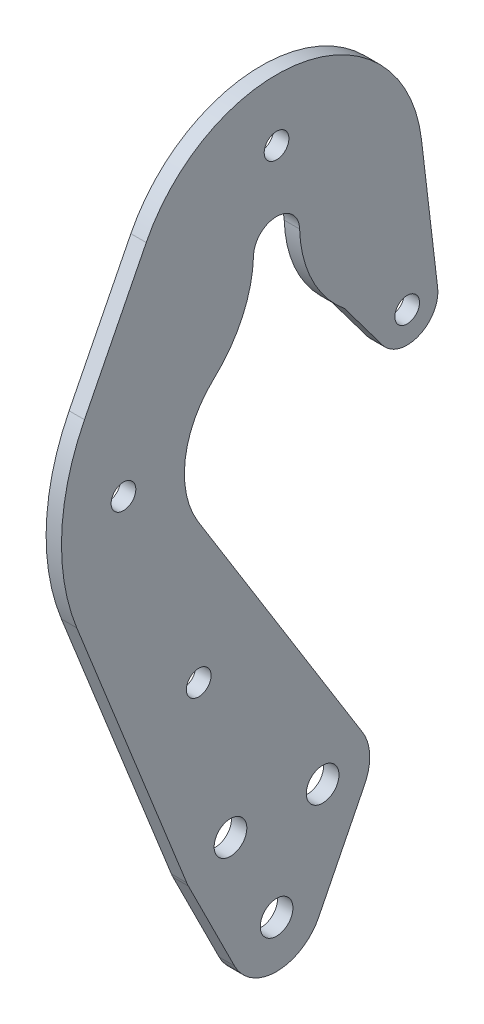
ISO-10303-21;
HEADER;
FILE_DESCRIPTION(('STEP AP214'),'2;1');
FILE_NAME('part.step','',(''),(''),'','','');
FILE_SCHEMA(('AUTOMOTIVE_DESIGN { 1 0 10303 214 1 1 1 1 }'));
ENDSEC;
DATA;
#1=APPLICATION_CONTEXT('core data for automotive mechanical design processes');
#2=APPLICATION_PROTOCOL_DEFINITION('international standard','automotive_design',2000,#1);
#3=PRODUCT_CONTEXT('',#1,'mechanical');
#4=PRODUCT('Part','Part','',(#3));
#5=PRODUCT_RELATED_PRODUCT_CATEGORY('part','',(#4));
#6=PRODUCT_DEFINITION_FORMATION('','',#4);
#7=PRODUCT_DEFINITION_CONTEXT('part definition',#1,'design');
#8=PRODUCT_DEFINITION('design','',#6,#7);
#9=PRODUCT_DEFINITION_SHAPE('','',#8);
#10=(LENGTH_UNIT() NAMED_UNIT(*) SI_UNIT(.MILLI.,.METRE.));
#11=(NAMED_UNIT(*) PLANE_ANGLE_UNIT() SI_UNIT($,.RADIAN.));
#12=(NAMED_UNIT(*) SI_UNIT($,.STERADIAN.) SOLID_ANGLE_UNIT());
#13=UNCERTAINTY_MEASURE_WITH_UNIT(LENGTH_MEASURE(1.E-05),#10,'distance_accuracy_value','');
#14=(GEOMETRIC_REPRESENTATION_CONTEXT(3) GLOBAL_UNCERTAINTY_ASSIGNED_CONTEXT((#13)) GLOBAL_UNIT_ASSIGNED_CONTEXT((#10,
#11,#12)) REPRESENTATION_CONTEXT('',''));
#15=CARTESIAN_POINT('',(0.,0.,0.));
#16=DIRECTION('',(0.,0.,1.));
#17=DIRECTION('',(1.,0.,0.));
#18=AXIS2_PLACEMENT_3D('',#15,#16,#17);
#19=CARTESIAN_POINT('',(3.175,9.40488249066941,-15.1340807151165));
#20=DIRECTION('',(0.,0.527821205333736,-0.849355505780731));
#21=DIRECTION('',(0.,0.849355505780731,0.527821205333736));
#22=AXIS2_PLACEMENT_3D('',#19,#20,#21);
#23=PLANE('',#22);
#24=DIRECTION('',(0.,-0.849355505780731,-0.527821205333736));
#25=VECTOR('',#24,1.);
#26=CARTESIAN_POINT('',(0.,9.40488249066941,-15.1340807151165));
#27=LINE('',#26,#25);
#28=CARTESIAN_POINT('',(0.,59.7950060383923,16.1802223851229));
#29=VERTEX_POINT('',#28);
#30=CARTESIAN_POINT('',(0.,5.13475024972766,-17.7877002313361));
#31=VERTEX_POINT('',#30);
#32=EDGE_CURVE('E199',#29,#31,#27,.T.);
#33=ORIENTED_EDGE('',*,*,#32,.F.);
#34=DIRECTION('',(-1.,0.,0.));
#35=VECTOR('',#34,1.);
#36=CARTESIAN_POINT('',(3.175,59.7950060383923,16.1802223851229));
#37=LINE('',#36,#35);
#38=CARTESIAN_POINT('',(3.175,59.7950060383923,16.1802223851229));
#39=VERTEX_POINT('',#38);
#40=EDGE_CURVE('E11',#39,#29,#37,.T.);
#41=ORIENTED_EDGE('',*,*,#40,.F.);
#42=DIRECTION('',(0.,-0.849355505780731,-0.527821205333736));
#43=VECTOR('',#42,1.);
#44=CARTESIAN_POINT('',(3.175,9.40488249066941,-15.1340807151165));
#45=LINE('',#44,#43);
#46=CARTESIAN_POINT('',(3.175,5.13475024972766,-17.7877002313361));
#47=VERTEX_POINT('',#46);
#48=EDGE_CURVE('E295',#39,#47,#45,.T.);
#49=ORIENTED_EDGE('',*,*,#48,.T.);
#50=DIRECTION('',(-1.,0.,0.));
#51=VECTOR('',#50,1.);
#52=CARTESIAN_POINT('',(3.175,5.13475024972766,-17.7877002313361));
#53=LINE('',#52,#51);
#54=EDGE_CURVE('E118',#47,#31,#53,.T.);
#55=ORIENTED_EDGE('',*,*,#54,.T.);
#56=EDGE_LOOP('',(#33,#41,#49,#55));
#57=FACE_BOUND('',#56,.T.);
#58=ADVANCED_FACE('F40',(#57),#23,.T.);
#59=CARTESIAN_POINT('',(3.175,69.85,0.));
#60=DIRECTION('',(-1.,0.,0.));
#61=DIRECTION('',(0.,0.,1.));
#62=AXIS2_PLACEMENT_3D('',#59,#60,#61);
#63=CYLINDRICAL_SURFACE('',#62,19.05);
#64=CARTESIAN_POINT('',(0.,69.85,0.));
#65=DIRECTION('',(1.,0.,0.));
#66=DIRECTION('',(0.,0.,-1.));
#67=AXIS2_PLACEMENT_3D('',#64,#65,#66);
#68=CIRCLE('',#67,19.05);
#69=CARTESIAN_POINT('',(0.,83.8483482142857,12.9208648035495));
#70=VERTEX_POINT('',#69);
#71=EDGE_CURVE('E202',#29,#70,#68,.F.);
#72=ORIENTED_EDGE('',*,*,#71,.T.);
#73=DIRECTION('',(-1.,0.,0.));
#74=VECTOR('',#73,1.);
#75=CARTESIAN_POINT('',(3.175,83.8483482142857,12.9208648035495));
#76=LINE('',#75,#74);
#77=CARTESIAN_POINT('',(3.175,83.8483482142857,12.9208648035495));
#78=VERTEX_POINT('',#77);
#79=EDGE_CURVE('E49',#78,#70,#76,.T.);
#80=ORIENTED_EDGE('',*,*,#79,.F.);
#81=CARTESIAN_POINT('',(3.175,69.85,0.));
#82=DIRECTION('',(1.,0.,0.));
#83=DIRECTION('',(0.,0.,-1.));
#84=AXIS2_PLACEMENT_3D('',#81,#82,#83);
#85=CIRCLE('',#84,19.05);
#86=EDGE_CURVE('E291',#39,#78,#85,.F.);
#87=ORIENTED_EDGE('',*,*,#86,.F.);
#88=ORIENTED_EDGE('',*,*,#40,.T.);
#89=EDGE_LOOP('',(#72,#80,#87,#88));
#90=FACE_BOUND('',#89,.T.);
#91=ADVANCED_FACE('F280',(#90),#63,.F.);
#92=CARTESIAN_POINT('',(3.175,102.5128125,30.1486845416155));
#93=DIRECTION('',(-1.,0.,0.));
#94=DIRECTION('',(0.,0.,1.));
#95=AXIS2_PLACEMENT_3D('',#92,#93,#94);
#96=CYLINDRICAL_SURFACE('',#95,25.4);
#97=CARTESIAN_POINT('',(0.,102.5128125,30.1486845416155));
#98=DIRECTION('',(1.,0.,0.));
#99=DIRECTION('',(0.,0.,-1.));
#100=AXIS2_PLACEMENT_3D('',#97,#98,#99);
#101=CIRCLE('',#100,25.4);
#102=CARTESIAN_POINT('',(0.,101.744128289474,4.76031861183403));
#103=VERTEX_POINT('',#102);
#104=EDGE_CURVE('E205',#103,#70,#101,.F.);
#105=ORIENTED_EDGE('',*,*,#104,.F.);
#106=DIRECTION('',(-1.,0.,0.));
#107=VECTOR('',#106,1.);
#108=CARTESIAN_POINT('',(3.175,101.744128289474,4.76031861183403));
#109=LINE('',#108,#107);
#110=CARTESIAN_POINT('',(3.175,101.744128289474,4.76031861183403));
#111=VERTEX_POINT('',#110);
#112=EDGE_CURVE('E270',#111,#103,#109,.T.);
#113=ORIENTED_EDGE('',*,*,#112,.F.);
#114=CARTESIAN_POINT('',(3.175,102.5128125,30.1486845416155));
#115=DIRECTION('',(1.,0.,0.));
#116=DIRECTION('',(0.,0.,-1.));
#117=AXIS2_PLACEMENT_3D('',#114,#115,#116);
#118=CIRCLE('',#117,25.4);
#119=EDGE_CURVE('E277',#111,#78,#118,.F.);
#120=ORIENTED_EDGE('',*,*,#119,.T.);
#121=ORIENTED_EDGE('',*,*,#79,.T.);
#122=EDGE_LOOP('',(#105,#113,#120,#121));
#123=FACE_BOUND('',#122,.T.);
#124=ADVANCED_FACE('F275',(#123),#96,.T.);
#125=CARTESIAN_POINT('',(3.175,101.6,0.));
#126=DIRECTION('',(-1.,0.,0.));
#127=DIRECTION('',(0.,0.,1.));
#128=AXIS2_PLACEMENT_3D('',#125,#126,#127);
#129=CYLINDRICAL_SURFACE('',#128,4.7625);
#130=CARTESIAN_POINT('',(0.,101.6,0.));
#131=DIRECTION('',(1.,0.,0.));
#132=DIRECTION('',(0.,0.,-1.));
#133=AXIS2_PLACEMENT_3D('',#130,#131,#132);
#134=CIRCLE('',#133,4.7625);
#135=CARTESIAN_POINT('',(0.,101.744128289474,-4.76031861183403));
#136=VERTEX_POINT('',#135);
#137=EDGE_CURVE('E208',#136,#103,#134,.T.);
#138=ORIENTED_EDGE('',*,*,#137,.F.);
#139=DIRECTION('',(-1.,0.,0.));
#140=VECTOR('',#139,1.);
#141=CARTESIAN_POINT('',(3.175,101.744128289474,-4.76031861183403));
#142=LINE('',#141,#140);
#143=CARTESIAN_POINT('',(3.175,101.744128289474,-4.76031861183403));
#144=VERTEX_POINT('',#143);
#145=EDGE_CURVE('E268',#144,#136,#142,.T.);
#146=ORIENTED_EDGE('',*,*,#145,.F.);
#147=CARTESIAN_POINT('',(3.175,101.6,0.));
#148=DIRECTION('',(1.,0.,0.));
#149=DIRECTION('',(0.,0.,-1.));
#150=AXIS2_PLACEMENT_3D('',#147,#148,#149);
#151=CIRCLE('',#150,4.7625);
#152=EDGE_CURVE('E290',#144,#111,#151,.T.);
#153=ORIENTED_EDGE('',*,*,#152,.T.);
#154=ORIENTED_EDGE('',*,*,#112,.T.);
#155=EDGE_LOOP('',(#138,#146,#153,#154));
#156=FACE_BOUND('',#155,.T.);
#157=ADVANCED_FACE('F286',(#156),#129,.F.);
#158=CARTESIAN_POINT('',(3.175,102.5128125,-30.1486845416155));
#159=DIRECTION('',(-1.,0.,0.));
#160=DIRECTION('',(0.,0.,1.));
#161=AXIS2_PLACEMENT_3D('',#158,#159,#160);
#162=CYLINDRICAL_SURFACE('',#161,25.4);
#163=CARTESIAN_POINT('',(0.,102.5128125,-30.1486845416155));
#164=DIRECTION('',(1.,0.,0.));
#165=DIRECTION('',(0.,0.,-1.));
#166=AXIS2_PLACEMENT_3D('',#163,#164,#165);
#167=CIRCLE('',#166,25.4);
#168=CARTESIAN_POINT('',(0.,82.8652597425084,-14.0510551931187));
#169=VERTEX_POINT('',#168);
#170=EDGE_CURVE('E211',#136,#169,#167,.T.);
#171=ORIENTED_EDGE('',*,*,#170,.T.);
#172=DIRECTION('',(-1.,0.,0.));
#173=VECTOR('',#172,1.);
#174=CARTESIAN_POINT('',(3.175,82.8652597425084,-14.0510551931187));
#175=LINE('',#174,#173);
#176=CARTESIAN_POINT('',(3.175,82.8652597425084,-14.0510551931187));
#177=VERTEX_POINT('',#176);
#178=EDGE_CURVE('E266',#177,#169,#175,.T.);
#179=ORIENTED_EDGE('',*,*,#178,.F.);
#180=CARTESIAN_POINT('',(3.175,102.5128125,-30.1486845416155));
#181=DIRECTION('',(1.,0.,0.));
#182=DIRECTION('',(0.,0.,-1.));
#183=AXIS2_PLACEMENT_3D('',#180,#181,#182);
#184=CIRCLE('',#183,25.4);
#185=EDGE_CURVE('E293',#144,#177,#184,.T.);
#186=ORIENTED_EDGE('',*,*,#185,.F.);
#187=ORIENTED_EDGE('',*,*,#145,.T.);
#188=EDGE_LOOP('',(#171,#179,#186,#187));
#189=FACE_BOUND('',#188,.T.);
#190=ADVANCED_FACE('F458',(#189),#162,.T.);
#191=CARTESIAN_POINT('',(3.175,36.576,-48.768));
#192=DIRECTION('',(0.,-0.6,0.8));
#193=DIRECTION('',(0.,-0.8,-0.6));
#194=AXIS2_PLACEMENT_3D('',#191,#192,#193);
#195=PLANE('',#194);
#196=DIRECTION('',(0.,0.8,0.6));
#197=VECTOR('',#196,1.);
#198=CARTESIAN_POINT('',(0.,36.576,-48.768));
#199=LINE('',#198,#197);
#200=CARTESIAN_POINT('',(0.,72.39,-21.9075));
#201=VERTEX_POINT('',#200);
#202=EDGE_CURVE('E214',#201,#169,#199,.T.);
#203=ORIENTED_EDGE('',*,*,#202,.F.);
#204=DIRECTION('',(-1.,0.,0.));
#205=VECTOR('',#204,1.);
#206=CARTESIAN_POINT('',(3.175,72.39,-21.9075));
#207=LINE('',#206,#205);
#208=CARTESIAN_POINT('',(3.175,72.39,-21.9075));
#209=VERTEX_POINT('',#208);
#210=EDGE_CURVE('E264',#209,#201,#207,.T.);
#211=ORIENTED_EDGE('',*,*,#210,.F.);
#212=DIRECTION('',(0.,0.8,0.6));
#213=VECTOR('',#212,1.);
#214=CARTESIAN_POINT('',(3.175,36.576,-48.768));
#215=LINE('',#214,#213);
#216=EDGE_CURVE('E300',#209,#177,#215,.T.);
#217=ORIENTED_EDGE('',*,*,#216,.T.);
#218=ORIENTED_EDGE('',*,*,#178,.T.);
#219=EDGE_LOOP('',(#203,#211,#217,#218));
#220=FACE_BOUND('',#219,.T.);
#221=ADVANCED_FACE('F454',(#220),#195,.T.);
#222=CARTESIAN_POINT('',(3.175,76.2,-26.9875));
#223=DIRECTION('',(-1.,0.,0.));
#224=DIRECTION('',(0.,0.,1.));
#225=AXIS2_PLACEMENT_3D('',#222,#223,#224);
#226=CYLINDRICAL_SURFACE('',#225,6.34999999999999);
#227=CARTESIAN_POINT('',(0.,76.2,-26.9875));
#228=DIRECTION('',(1.,0.,0.));
#229=DIRECTION('',(0.,0.,-1.));
#230=AXIS2_PLACEMENT_3D('',#227,#228,#229);
#231=CIRCLE('',#230,6.34999999999999);
#232=CARTESIAN_POINT('',(0.,76.9469143217777,-33.2934193616731));
#233=VERTEX_POINT('',#232);
#234=EDGE_CURVE('E217',#233,#201,#231,.F.);
#235=ORIENTED_EDGE('',*,*,#234,.F.);
#236=DIRECTION('',(-1.,0.,0.));
#237=VECTOR('',#236,1.);
#238=CARTESIAN_POINT('',(3.175,76.9469143217777,-33.2934193616731));
#239=LINE('',#238,#237);
#240=CARTESIAN_POINT('',(3.175,76.9469143217777,-33.2934193616731));
#241=VERTEX_POINT('',#240);
#242=EDGE_CURVE('E262',#241,#233,#239,.T.);
#243=ORIENTED_EDGE('',*,*,#242,.F.);
#244=CARTESIAN_POINT('',(3.175,76.2,-26.9875));
#245=DIRECTION('',(1.,0.,0.));
#246=DIRECTION('',(0.,0.,-1.));
#247=AXIS2_PLACEMENT_3D('',#244,#245,#246);
#248=CIRCLE('',#247,6.34999999999999);
#249=EDGE_CURVE('E303',#241,#209,#248,.F.);
#250=ORIENTED_EDGE('',*,*,#249,.T.);
#251=ORIENTED_EDGE('',*,*,#210,.T.);
#252=EDGE_LOOP('',(#235,#243,#250,#251));
#253=FACE_BOUND('',#252,.T.);
#254=ADVANCED_FACE('F450',(#253),#226,.T.);
#255=CARTESIAN_POINT('',(3.175,4.95352744816432,-41.8207868468979));
#256=DIRECTION('',(0.,0.11762430264215,-0.993058167192611));
#257=DIRECTION('',(0.,0.993058167192611,0.11762430264215));
#258=AXIS2_PLACEMENT_3D('',#255,#256,#257);
#259=PLANE('',#258);
#260=DIRECTION('',(0.,-0.993058167192611,-0.11762430264215));
#261=VECTOR('',#260,1.);
#262=CARTESIAN_POINT('',(0.,4.95352744816432,-41.8207868468979));
#263=LINE('',#262,#261);
#264=CARTESIAN_POINT('',(0.,105.147843028444,-29.9531169679471));
#265=VERTEX_POINT('',#264);
#266=EDGE_CURVE('E220',#265,#233,#263,.T.);
#267=ORIENTED_EDGE('',*,*,#266,.F.);
#268=DIRECTION('',(-1.,0.,0.));
#269=VECTOR('',#268,1.);
#270=CARTESIAN_POINT('',(3.175,105.147843028444,-29.9531169679471));
#271=LINE('',#270,#269);
#272=CARTESIAN_POINT('',(3.175,105.147843028444,-29.9531169679471));
#273=VERTEX_POINT('',#272);
#274=EDGE_CURVE('E260',#273,#265,#271,.T.);
#275=ORIENTED_EDGE('',*,*,#274,.F.);
#276=DIRECTION('',(0.,-0.993058167192611,-0.11762430264215));
#277=VECTOR('',#276,1.);
#278=CARTESIAN_POINT('',(3.175,4.95352744816432,-41.8207868468979));
#279=LINE('',#278,#277);
#280=EDGE_CURVE('E306',#273,#241,#279,.T.);
#281=ORIENTED_EDGE('',*,*,#280,.T.);
#282=ORIENTED_EDGE('',*,*,#242,.T.);
#283=EDGE_LOOP('',(#267,#275,#281,#282));
#284=FACE_BOUND('',#283,.T.);
#285=ADVANCED_FACE('F446',(#284),#259,.T.);
#286=CARTESIAN_POINT('',(3.175,101.6,0.));
#287=DIRECTION('',(-1.,0.,0.));
#288=DIRECTION('',(0.,0.,1.));
#289=AXIS2_PLACEMENT_3D('',#286,#287,#288);
#290=CYLINDRICAL_SURFACE('',#289,30.1625);
#291=CARTESIAN_POINT('',(0.,101.6,0.));
#292=DIRECTION('',(1.,0.,0.));
#293=DIRECTION('',(0.,0.,-1.));
#294=AXIS2_PLACEMENT_3D('',#291,#292,#293);
#295=CIRCLE('',#294,30.1625);
#296=CARTESIAN_POINT('',(0.,115.173125,26.935973789421));
#297=VERTEX_POINT('',#296);
#298=EDGE_CURVE('E223',#297,#265,#295,.F.);
#299=ORIENTED_EDGE('',*,*,#298,.F.);
#300=DIRECTION('',(-1.,0.,0.));
#301=VECTOR('',#300,1.);
#302=CARTESIAN_POINT('',(3.175,115.173125,26.935973789421));
#303=LINE('',#302,#301);
#304=CARTESIAN_POINT('',(3.175,115.173125,26.935973789421));
#305=VERTEX_POINT('',#304);
#306=EDGE_CURVE('E258',#305,#297,#303,.T.);
#307=ORIENTED_EDGE('',*,*,#306,.F.);
#308=CARTESIAN_POINT('',(3.175,101.6,0.));
#309=DIRECTION('',(1.,0.,0.));
#310=DIRECTION('',(0.,0.,-1.));
#311=AXIS2_PLACEMENT_3D('',#308,#309,#310);
#312=CIRCLE('',#311,30.1625);
#313=EDGE_CURVE('E309',#305,#273,#312,.F.);
#314=ORIENTED_EDGE('',*,*,#313,.T.);
#315=ORIENTED_EDGE('',*,*,#274,.T.);
#316=EDGE_LOOP('',(#299,#307,#314,#315));
#317=FACE_BOUND('',#316,.T.);
#318=ADVANCED_FACE('F442',(#317),#290,.T.);
#319=CARTESIAN_POINT('',(3.175,34.1471250000001,67.7652393228592));
#320=DIRECTION('',(0.,0.450000000000001,0.893028554974587));
#321=DIRECTION('',(0.,-0.893028554974587,0.450000000000001));
#322=AXIS2_PLACEMENT_3D('',#319,#320,#321);
#323=PLANE('',#322);
#324=DIRECTION('',(0.,0.893028554974587,-0.450000000000001));
#325=VECTOR('',#324,1.);
#326=CARTESIAN_POINT('',(0.,34.1471250000001,67.7652393228592));
#327=LINE('',#326,#325);
#328=CARTESIAN_POINT('',(0.,89.8525,39.6951192686204));
#329=VERTEX_POINT('',#328);
#330=EDGE_CURVE('E226',#329,#297,#327,.T.);
#331=ORIENTED_EDGE('',*,*,#330,.F.);
#332=DIRECTION('',(-1.,0.,0.));
#333=VECTOR('',#332,1.);
#334=CARTESIAN_POINT('',(3.175,89.8525,39.6951192686204));
#335=LINE('',#334,#333);
#336=CARTESIAN_POINT('',(3.175,89.8525,39.6951192686204));
#337=VERTEX_POINT('',#336);
#338=EDGE_CURVE('E256',#337,#329,#335,.T.);
#339=ORIENTED_EDGE('',*,*,#338,.F.);
#340=DIRECTION('',(0.,0.893028554974587,-0.450000000000001));
#341=VECTOR('',#340,1.);
#342=CARTESIAN_POINT('',(3.175,34.1471250000001,67.7652393228592));
#343=LINE('',#342,#341);
#344=EDGE_CURVE('E312',#337,#305,#343,.T.);
#345=ORIENTED_EDGE('',*,*,#344,.T.);
#346=ORIENTED_EDGE('',*,*,#306,.T.);
#347=EDGE_LOOP('',(#331,#339,#345,#346));
#348=FACE_BOUND('',#347,.T.);
#349=ADVANCED_FACE('F438',(#348),#323,.T.);
#350=CARTESIAN_POINT('',(3.175,69.85,0.));
#351=DIRECTION('',(-1.,0.,0.));
#352=DIRECTION('',(0.,0.,1.));
#353=AXIS2_PLACEMENT_3D('',#350,#351,#352);
#354=CYLINDRICAL_SURFACE('',#353,44.45);
#355=CARTESIAN_POINT('',(0.,69.85,0.));
#356=DIRECTION('',(1.,0.,0.));
#357=DIRECTION('',(0.,0.,-1.));
#358=AXIS2_PLACEMENT_3D('',#355,#356,#357);
#359=CIRCLE('',#358,44.45);
#360=CARTESIAN_POINT('',(0.,53.384474434756,41.2878791882109));
#361=VERTEX_POINT('',#360);
#362=EDGE_CURVE('E229',#329,#361,#359,.T.);
#363=ORIENTED_EDGE('',*,*,#362,.T.);
#364=DIRECTION('',(-1.,0.,0.));
#365=VECTOR('',#364,1.);
#366=CARTESIAN_POINT('',(3.175,53.384474434756,41.2878791882109));
#367=LINE('',#366,#365);
#368=CARTESIAN_POINT('',(3.175,53.384474434756,41.2878791882109));
#369=VERTEX_POINT('',#368);
#370=EDGE_CURVE('E254',#369,#361,#367,.T.);
#371=ORIENTED_EDGE('',*,*,#370,.F.);
#372=CARTESIAN_POINT('',(3.175,69.85,0.));
#373=DIRECTION('',(1.,0.,0.));
#374=DIRECTION('',(0.,0.,-1.));
#375=AXIS2_PLACEMENT_3D('',#372,#373,#374);
#376=CIRCLE('',#375,44.45);
#377=EDGE_CURVE('E315',#337,#369,#376,.T.);
#378=ORIENTED_EDGE('',*,*,#377,.F.);
#379=ORIENTED_EDGE('',*,*,#338,.T.);
#380=EDGE_LOOP('',(#363,#371,#378,#379));
#381=FACE_BOUND('',#380,.T.);
#382=ADVANCED_FACE('F434',(#381),#354,.T.);
#383=CARTESIAN_POINT('',(3.175,-6.8809237541023,17.254156117698));
#384=DIRECTION('',(0.,-0.370428021715275,0.928861174087984));
#385=DIRECTION('',(0.,-0.928861174087984,-0.370428021715275));
#386=AXIS2_PLACEMENT_3D('',#383,#384,#385);
#387=PLANE('',#386);
#388=DIRECTION('',(0.,0.928861174087984,0.370428021715275));
#389=VECTOR('',#388,1.);
#390=CARTESIAN_POINT('',(0.,-6.8809237541023,17.254156117698));
#391=LINE('',#390,#389);
#392=CARTESIAN_POINT('',(0.,-3.60359788085054,18.5611472737627));
#393=VERTEX_POINT('',#392);
#394=EDGE_CURVE('E232',#393,#361,#391,.T.);
#395=ORIENTED_EDGE('',*,*,#394,.F.);
#396=DIRECTION('',(-1.,0.,0.));
#397=VECTOR('',#396,1.);
#398=CARTESIAN_POINT('',(3.175,-3.60359788085054,18.5611472737627));
#399=LINE('',#398,#397);
#400=CARTESIAN_POINT('',(3.175,-3.60359788085054,18.5611472737627));
#401=VERTEX_POINT('',#400);
#402=EDGE_CURVE('E252',#401,#393,#399,.T.);
#403=ORIENTED_EDGE('',*,*,#402,.F.);
#404=DIRECTION('',(0.,0.928861174087984,0.370428021715275));
#405=VECTOR('',#404,1.);
#406=CARTESIAN_POINT('',(3.175,-6.8809237541023,17.254156117698));
#407=LINE('',#406,#405);
#408=EDGE_CURVE('E317',#401,#369,#407,.T.);
#409=ORIENTED_EDGE('',*,*,#408,.T.);
#410=ORIENTED_EDGE('',*,*,#370,.T.);
#411=EDGE_LOOP('',(#395,#403,#409,#410));
#412=FACE_BOUND('',#411,.T.);
#413=ADVANCED_FACE('F430',(#412),#387,.T.);
#414=CARTESIAN_POINT('',(3.175,0.,9.525));
#415=DIRECTION('',(-1.,0.,0.));
#416=DIRECTION('',(0.,0.,1.));
#417=AXIS2_PLACEMENT_3D('',#414,#415,#416);
#418=CYLINDRICAL_SURFACE('',#417,9.7282);
#419=CARTESIAN_POINT('',(0.,0.,9.525));
#420=DIRECTION('',(1.,0.,0.));
#421=DIRECTION('',(0.,0.,-1.));
#422=AXIS2_PLACEMENT_3D('',#419,#420,#421);
#423=CIRCLE('',#422,9.7282);
#424=CARTESIAN_POINT('',(0.,-4.35058329974269,18.2261665994854));
#425=VERTEX_POINT('',#424);
#426=EDGE_CURVE('E235',#425,#393,#423,.F.);
#427=ORIENTED_EDGE('',*,*,#426,.F.);
#428=DIRECTION('',(-1.,0.,0.));
#429=VECTOR('',#428,1.);
#430=CARTESIAN_POINT('',(3.175,-4.35058329974269,18.2261665994854));
#431=LINE('',#430,#429);
#432=CARTESIAN_POINT('',(3.175,-4.35058329974269,18.2261665994854));
#433=VERTEX_POINT('',#432);
#434=EDGE_CURVE('E250',#433,#425,#431,.T.);
#435=ORIENTED_EDGE('',*,*,#434,.F.);
#436=CARTESIAN_POINT('',(3.175,0.,9.525));
#437=DIRECTION('',(1.,0.,0.));
#438=DIRECTION('',(0.,0.,-1.));
#439=AXIS2_PLACEMENT_3D('',#436,#437,#438);
#440=CIRCLE('',#439,9.7282);
#441=EDGE_CURVE('E320',#433,#401,#440,.F.);
#442=ORIENTED_EDGE('',*,*,#441,.T.);
#443=ORIENTED_EDGE('',*,*,#402,.T.);
#444=EDGE_LOOP('',(#427,#435,#442,#443));
#445=FACE_BOUND('',#444,.T.);
#446=ADVANCED_FACE('F427',(#445),#418,.T.);
#447=CARTESIAN_POINT('',(3.175,-8.16058329974269,16.3211665994854));
#448=DIRECTION('',(0.,-0.447213595499958,0.894427190999916));
#449=DIRECTION('',(0.,-0.894427190999916,-0.447213595499958));
#450=AXIS2_PLACEMENT_3D('',#447,#448,#449);
#451=PLANE('',#450);
#452=DIRECTION('',(0.,0.894427190999916,0.447213595499958));
#453=VECTOR('',#452,1.);
#454=CARTESIAN_POINT('',(0.,-8.16058329974269,16.3211665994854));
#455=LINE('',#454,#453);
#456=CARTESIAN_POINT('',(0.,-23.4005832997427,8.70116659948538));
#457=VERTEX_POINT('',#456);
#458=EDGE_CURVE('E238',#457,#425,#455,.T.);
#459=ORIENTED_EDGE('',*,*,#458,.F.);
#460=DIRECTION('',(-1.,0.,0.));
#461=VECTOR('',#460,1.);
#462=CARTESIAN_POINT('',(3.175,-23.4005832997427,8.70116659948538));
#463=LINE('',#462,#461);
#464=CARTESIAN_POINT('',(3.175,-23.4005832997427,8.70116659948538));
#465=VERTEX_POINT('',#464);
#466=EDGE_CURVE('E175',#465,#457,#463,.T.);
#467=ORIENTED_EDGE('',*,*,#466,.F.);
#468=DIRECTION('',(0.,0.894427190999916,0.447213595499958));
#469=VECTOR('',#468,1.);
#470=CARTESIAN_POINT('',(3.175,-8.16058329974269,16.3211665994854));
#471=LINE('',#470,#469);
#472=EDGE_CURVE('E182',#465,#433,#471,.T.);
#473=ORIENTED_EDGE('',*,*,#472,.T.);
#474=ORIENTED_EDGE('',*,*,#434,.T.);
#475=EDGE_LOOP('',(#459,#467,#473,#474));
#476=FACE_BOUND('',#475,.T.);
#477=ADVANCED_FACE('F324',(#476),#451,.T.);
#478=CARTESIAN_POINT('',(3.175,-19.05,0.));
#479=DIRECTION('',(-1.,0.,0.));
#480=DIRECTION('',(0.,0.,1.));
#481=AXIS2_PLACEMENT_3D('',#478,#479,#480);
#482=CYLINDRICAL_SURFACE('',#481,9.7282);
#483=CARTESIAN_POINT('',(0.,-19.05,0.));
#484=DIRECTION('',(1.,0.,0.));
#485=DIRECTION('',(0.,0.,-1.));
#486=AXIS2_PLACEMENT_3D('',#483,#484,#485);
#487=CIRCLE('',#486,9.7282);
#488=CARTESIAN_POINT('',(0.,-23.4005832997427,-8.70116659948537));
#489=VERTEX_POINT('',#488);
#490=EDGE_CURVE('E170',#489,#457,#487,.F.);
#491=ORIENTED_EDGE('',*,*,#490,.F.);
#492=DIRECTION('',(-1.,0.,0.));
#493=VECTOR('',#492,1.);
#494=CARTESIAN_POINT('',(3.175,-23.4005832997427,-8.70116659948537));
#495=LINE('',#494,#493);
#496=CARTESIAN_POINT('',(3.175,-23.4005832997427,-8.70116659948537));
#497=VERTEX_POINT('',#496);
#498=EDGE_CURVE('E165',#497,#489,#495,.T.);
#499=ORIENTED_EDGE('',*,*,#498,.F.);
#500=CARTESIAN_POINT('',(3.175,-19.05,0.));
#501=DIRECTION('',(1.,0.,0.));
#502=DIRECTION('',(0.,0.,-1.));
#503=AXIS2_PLACEMENT_3D('',#500,#501,#502);
#504=CIRCLE('',#503,9.7282);
#505=EDGE_CURVE('E168',#497,#465,#504,.F.);
#506=ORIENTED_EDGE('',*,*,#505,.T.);
#507=ORIENTED_EDGE('',*,*,#466,.T.);
#508=EDGE_LOOP('',(#491,#499,#506,#507));
#509=FACE_BOUND('',#508,.T.);
#510=ADVANCED_FACE('F167',(#509),#482,.T.);
#511=CARTESIAN_POINT('',(3.175,-8.16058329974269,-16.3211665994854));
#512=DIRECTION('',(0.,-0.447213595499958,-0.894427190999916));
#513=DIRECTION('',(0.,0.894427190999916,-0.447213595499958));
#514=AXIS2_PLACEMENT_3D('',#511,#512,#513);
#515=PLANE('',#514);
#516=DIRECTION('',(0.,-0.894427190999916,0.447213595499958));
#517=VECTOR('',#516,1.);
#518=CARTESIAN_POINT('',(0.,-8.16058329974269,-16.3211665994854));
#519=LINE('',#518,#517);
#520=CARTESIAN_POINT('',(0.,-4.35058329974269,-18.2261665994854));
#521=VERTEX_POINT('',#520);
#522=EDGE_CURVE('E242',#521,#489,#519,.T.);
#523=ORIENTED_EDGE('',*,*,#522,.F.);
#524=DIRECTION('',(-1.,0.,0.));
#525=VECTOR('',#524,1.);
#526=CARTESIAN_POINT('',(3.175,-4.35058329974269,-18.2261665994854));
#527=LINE('',#526,#525);
#528=CARTESIAN_POINT('',(3.175,-4.35058329974269,-18.2261665994854));
#529=VERTEX_POINT('',#528);
#530=EDGE_CURVE('E111',#529,#521,#527,.T.);
#531=ORIENTED_EDGE('',*,*,#530,.F.);
#532=DIRECTION('',(0.,-0.894427190999916,0.447213595499958));
#533=VECTOR('',#532,1.);
#534=CARTESIAN_POINT('',(3.175,-8.16058329974269,-16.3211665994854));
#535=LINE('',#534,#533);
#536=EDGE_CURVE('E179',#529,#497,#535,.T.);
#537=ORIENTED_EDGE('',*,*,#536,.T.);
#538=ORIENTED_EDGE('',*,*,#498,.T.);
#539=EDGE_LOOP('',(#523,#531,#537,#538));
#540=FACE_BOUND('',#539,.T.);
#541=ADVANCED_FACE('F184',(#540),#515,.T.);
#542=CARTESIAN_POINT('',(3.175,-19.05,0.));
#543=DIRECTION('',(-1.,0.,0.));
#544=DIRECTION('',(0.,0.,1.));
#545=AXIS2_PLACEMENT_3D('',#542,#543,#544);
#546=CYLINDRICAL_SURFACE('',#545,3.3782);
#547=CARTESIAN_POINT('',(3.175,-19.05,0.));
#548=DIRECTION('',(1.,0.,0.));
#549=DIRECTION('',(0.,0.,-1.));
#550=AXIS2_PLACEMENT_3D('',#547,#548,#549);
#551=CIRCLE('',#550,3.3782);
#552=CARTESIAN_POINT('',(3.175,-19.05,-3.3782));
#553=VERTEX_POINT('',#552);
#554=EDGE_CURVE('E327',#553,#553,#551,.T.);
#555=ORIENTED_EDGE('',*,*,#554,.T.);
#556=EDGE_LOOP('',(#555));
#557=FACE_BOUND('',#556,.T.);
#558=CARTESIAN_POINT('',(0.,-19.05,0.));
#559=DIRECTION('',(1.,0.,0.));
#560=DIRECTION('',(0.,0.,-1.));
#561=AXIS2_PLACEMENT_3D('',#558,#559,#560);
#562=CIRCLE('',#561,3.3782);
#563=CARTESIAN_POINT('',(0.,-19.05,-3.3782));
#564=VERTEX_POINT('',#563);
#565=EDGE_CURVE('E196',#564,#564,#562,.T.);
#566=ORIENTED_EDGE('',*,*,#565,.F.);
#567=EDGE_LOOP('',(#566));
#568=FACE_BOUND('',#567,.T.);
#569=ADVANCED_FACE('F377',(#557,#568),#546,.F.);
#570=CARTESIAN_POINT('',(3.175,0.,9.525));
#571=DIRECTION('',(-1.,0.,0.));
#572=DIRECTION('',(0.,0.,1.));
#573=AXIS2_PLACEMENT_3D('',#570,#571,#572);
#574=CYLINDRICAL_SURFACE('',#573,3.3782);
#575=CARTESIAN_POINT('',(3.175,0.,9.525));
#576=DIRECTION('',(1.,0.,0.));
#577=DIRECTION('',(0.,0.,-1.));
#578=AXIS2_PLACEMENT_3D('',#575,#576,#577);
#579=CIRCLE('',#578,3.3782);
#580=CARTESIAN_POINT('',(3.175,0.,6.1468));
#581=VERTEX_POINT('',#580);
#582=EDGE_CURVE('E329',#581,#581,#579,.T.);
#583=ORIENTED_EDGE('',*,*,#582,.T.);
#584=EDGE_LOOP('',(#583));
#585=FACE_BOUND('',#584,.T.);
#586=CARTESIAN_POINT('',(0.,0.,9.525));
#587=DIRECTION('',(1.,0.,0.));
#588=DIRECTION('',(0.,0.,-1.));
#589=AXIS2_PLACEMENT_3D('',#586,#587,#588);
#590=CIRCLE('',#589,3.3782);
#591=CARTESIAN_POINT('',(0.,0.,6.1468));
#592=VERTEX_POINT('',#591);
#593=EDGE_CURVE('E192',#592,#592,#590,.T.);
#594=ORIENTED_EDGE('',*,*,#593,.F.);
#595=EDGE_LOOP('',(#594));
#596=FACE_BOUND('',#595,.T.);
#597=ADVANCED_FACE('F380',(#585,#596),#574,.F.);
#598=CARTESIAN_POINT('',(3.175,0.,-9.525));
#599=DIRECTION('',(-1.,0.,0.));
#600=DIRECTION('',(0.,0.,1.));
#601=AXIS2_PLACEMENT_3D('',#598,#599,#600);
#602=CYLINDRICAL_SURFACE('',#601,3.3782);
#603=CARTESIAN_POINT('',(3.175,0.,-9.525));
#604=DIRECTION('',(1.,0.,0.));
#605=DIRECTION('',(0.,0.,-1.));
#606=AXIS2_PLACEMENT_3D('',#603,#604,#605);
#607=CIRCLE('',#606,3.3782);
#608=CARTESIAN_POINT('',(3.175,0.,-12.9032));
#609=VERTEX_POINT('',#608);
#610=EDGE_CURVE('E246',#609,#609,#607,.T.);
#611=ORIENTED_EDGE('',*,*,#610,.T.);
#612=EDGE_LOOP('',(#611));
#613=FACE_BOUND('',#612,.T.);
#614=CARTESIAN_POINT('',(0.,0.,-9.525));
#615=DIRECTION('',(1.,0.,0.));
#616=DIRECTION('',(0.,0.,-1.));
#617=AXIS2_PLACEMENT_3D('',#614,#615,#616);
#618=CIRCLE('',#617,3.3782);
#619=CARTESIAN_POINT('',(0.,0.,-12.9032));
#620=VERTEX_POINT('',#619);
#621=EDGE_CURVE('E189',#620,#620,#618,.T.);
#622=ORIENTED_EDGE('',*,*,#621,.F.);
#623=EDGE_LOOP('',(#622));
#624=FACE_BOUND('',#623,.T.);
#625=ADVANCED_FACE('F42',(#613,#624),#602,.F.);
#626=CARTESIAN_POINT('',(3.175,0.,-9.525));
#627=DIRECTION('',(-1.,0.,0.));
#628=DIRECTION('',(0.,0.,1.));
#629=AXIS2_PLACEMENT_3D('',#626,#627,#628);
#630=CYLINDRICAL_SURFACE('',#629,9.7282);
#631=CARTESIAN_POINT('',(0.,0.,-9.525));
#632=DIRECTION('',(1.,0.,0.));
#633=DIRECTION('',(0.,0.,-1.));
#634=AXIS2_PLACEMENT_3D('',#631,#632,#633);
#635=CIRCLE('',#634,9.7282);
#636=EDGE_CURVE('E244',#521,#31,#635,.T.);
#637=ORIENTED_EDGE('',*,*,#636,.T.);
#638=ORIENTED_EDGE('',*,*,#54,.F.);
#639=CARTESIAN_POINT('',(3.175,0.,-9.525));
#640=DIRECTION('',(1.,0.,0.));
#641=DIRECTION('',(0.,0.,-1.));
#642=AXIS2_PLACEMENT_3D('',#639,#640,#641);
#643=CIRCLE('',#642,9.7282);
#644=EDGE_CURVE('E57',#529,#47,#643,.T.);
#645=ORIENTED_EDGE('',*,*,#644,.F.);
#646=ORIENTED_EDGE('',*,*,#530,.T.);
#647=EDGE_LOOP('',(#637,#638,#645,#646));
#648=FACE_BOUND('',#647,.T.);
#649=ADVANCED_FACE('F326',(#648),#630,.T.);
#650=CARTESIAN_POINT('',(3.175,0.,0.));
#651=DIRECTION('',(1.,0.,0.));
#652=DIRECTION('',(0.,0.,-1.));
#653=AXIS2_PLACEMENT_3D('',#650,#651,#652);
#654=PLANE('',#653);
#655=CARTESIAN_POINT('',(3.175,31.0021164475706,16.0862953038164));
#656=DIRECTION('',(1.,0.,0.));
#657=DIRECTION('',(0.,0.,-1.));
#658=AXIS2_PLACEMENT_3D('',#655,#656,#657);
#659=CIRCLE('',#658,2.5527);
#660=CARTESIAN_POINT('',(3.175,31.0021164475706,13.5335953038164));
#661=VERTEX_POINT('',#660);
#662=EDGE_CURVE('E356',#661,#661,#659,.T.);
#663=ORIENTED_EDGE('',*,*,#662,.F.);
#664=EDGE_LOOP('',(#663));
#665=FACE_BOUND('',#664,.T.);
#666=CARTESIAN_POINT('',(3.175,72.0987638648508,31.6425710988188));
#667=DIRECTION('',(1.,0.,0.));
#668=DIRECTION('',(0.,0.,-1.));
#669=AXIS2_PLACEMENT_3D('',#666,#667,#668);
#670=CIRCLE('',#669,2.55270000000001);
#671=CARTESIAN_POINT('',(3.175,72.0987638648508,29.0898710988188));
#672=VERTEX_POINT('',#671);
#673=EDGE_CURVE('E350',#672,#672,#670,.T.);
#674=ORIENTED_EDGE('',*,*,#673,.F.);
#675=EDGE_LOOP('',(#674));
#676=FACE_BOUND('',#675,.T.);
#677=CARTESIAN_POINT('',(3.175,119.0625,0.));
#678=DIRECTION('',(1.,0.,0.));
#679=DIRECTION('',(0.,0.,-1.));
#680=AXIS2_PLACEMENT_3D('',#677,#678,#679);
#681=CIRCLE('',#680,2.55270000000001);
#682=CARTESIAN_POINT('',(3.175,119.0625,-2.55270000000001));
#683=VERTEX_POINT('',#682);
#684=EDGE_CURVE('E344',#683,#683,#681,.T.);
#685=ORIENTED_EDGE('',*,*,#684,.F.);
#686=EDGE_LOOP('',(#685));
#687=FACE_BOUND('',#686,.T.);
#688=CARTESIAN_POINT('',(3.175,76.2,-26.9875));
#689=DIRECTION('',(1.,0.,0.));
#690=DIRECTION('',(0.,0.,-1.));
#691=AXIS2_PLACEMENT_3D('',#688,#689,#690);
#692=CIRCLE('',#691,2.55270000000001);
#693=CARTESIAN_POINT('',(3.175,76.2,-29.5402));
#694=VERTEX_POINT('',#693);
#695=EDGE_CURVE('E338',#694,#694,#692,.T.);
#696=ORIENTED_EDGE('',*,*,#695,.F.);
#697=EDGE_LOOP('',(#696));
#698=FACE_BOUND('',#697,.T.);
#699=ORIENTED_EDGE('',*,*,#610,.F.);
#700=EDGE_LOOP('',(#699));
#701=FACE_BOUND('',#700,.T.);
#702=ORIENTED_EDGE('',*,*,#582,.F.);
#703=EDGE_LOOP('',(#702));
#704=FACE_BOUND('',#703,.T.);
#705=ORIENTED_EDGE('',*,*,#554,.F.);
#706=EDGE_LOOP('',(#705));
#707=FACE_BOUND('',#706,.T.);
#708=ORIENTED_EDGE('',*,*,#48,.F.);
#709=ORIENTED_EDGE('',*,*,#86,.T.);
#710=ORIENTED_EDGE('',*,*,#119,.F.);
#711=ORIENTED_EDGE('',*,*,#152,.F.);
#712=ORIENTED_EDGE('',*,*,#185,.T.);
#713=ORIENTED_EDGE('',*,*,#216,.F.);
#714=ORIENTED_EDGE('',*,*,#249,.F.);
#715=ORIENTED_EDGE('',*,*,#280,.F.);
#716=ORIENTED_EDGE('',*,*,#313,.F.);
#717=ORIENTED_EDGE('',*,*,#344,.F.);
#718=ORIENTED_EDGE('',*,*,#377,.T.);
#719=ORIENTED_EDGE('',*,*,#408,.F.);
#720=ORIENTED_EDGE('',*,*,#441,.F.);
#721=ORIENTED_EDGE('',*,*,#472,.F.);
#722=ORIENTED_EDGE('',*,*,#505,.F.);
#723=ORIENTED_EDGE('',*,*,#536,.F.);
#724=ORIENTED_EDGE('',*,*,#644,.T.);
#725=EDGE_LOOP('',(#708,#709,#710,#711,#712,#713,#714,#715,#716,#717,#718,#719,#720,#721,#722,
#723,#724));
#726=FACE_BOUND('',#725,.T.);
#727=ADVANCED_FACE('F178',(#665,#676,#687,#698,#701,#704,#707,#726),#654,.T.);
#728=CARTESIAN_POINT('',(0.,0.,0.));
#729=DIRECTION('',(1.,0.,0.));
#730=DIRECTION('',(0.,0.,-1.));
#731=AXIS2_PLACEMENT_3D('',#728,#729,#730);
#732=PLANE('',#731);
#733=CARTESIAN_POINT('',(0.,31.0021164475706,16.0862953038164));
#734=DIRECTION('',(1.,0.,0.));
#735=DIRECTION('',(0.,0.,-1.));
#736=AXIS2_PLACEMENT_3D('',#733,#734,#735);
#737=CIRCLE('',#736,2.5527);
#738=CARTESIAN_POINT('',(0.,31.0021164475706,13.5335953038164));
#739=VERTEX_POINT('',#738);
#740=EDGE_CURVE('E353',#739,#739,#737,.T.);
#741=ORIENTED_EDGE('',*,*,#740,.T.);
#742=EDGE_LOOP('',(#741));
#743=FACE_BOUND('',#742,.T.);
#744=CARTESIAN_POINT('',(0.,72.0987638648508,31.6425710988188));
#745=DIRECTION('',(1.,0.,0.));
#746=DIRECTION('',(0.,0.,-1.));
#747=AXIS2_PLACEMENT_3D('',#744,#745,#746);
#748=CIRCLE('',#747,2.55270000000001);
#749=CARTESIAN_POINT('',(0.,72.0987638648508,29.0898710988188));
#750=VERTEX_POINT('',#749);
#751=EDGE_CURVE('E347',#750,#750,#748,.T.);
#752=ORIENTED_EDGE('',*,*,#751,.T.);
#753=EDGE_LOOP('',(#752));
#754=FACE_BOUND('',#753,.T.);
#755=CARTESIAN_POINT('',(0.,119.0625,0.));
#756=DIRECTION('',(1.,0.,0.));
#757=DIRECTION('',(0.,0.,-1.));
#758=AXIS2_PLACEMENT_3D('',#755,#756,#757);
#759=CIRCLE('',#758,2.55270000000001);
#760=CARTESIAN_POINT('',(0.,119.0625,-2.55270000000001));
#761=VERTEX_POINT('',#760);
#762=EDGE_CURVE('E341',#761,#761,#759,.T.);
#763=ORIENTED_EDGE('',*,*,#762,.T.);
#764=EDGE_LOOP('',(#763));
#765=FACE_BOUND('',#764,.T.);
#766=CARTESIAN_POINT('',(0.,76.2,-26.9875));
#767=DIRECTION('',(1.,0.,0.));
#768=DIRECTION('',(0.,0.,-1.));
#769=AXIS2_PLACEMENT_3D('',#766,#767,#768);
#770=CIRCLE('',#769,2.55270000000001);
#771=CARTESIAN_POINT('',(0.,76.2,-29.5402));
#772=VERTEX_POINT('',#771);
#773=EDGE_CURVE('E193',#772,#772,#770,.T.);
#774=ORIENTED_EDGE('',*,*,#773,.T.);
#775=EDGE_LOOP('',(#774));
#776=FACE_BOUND('',#775,.T.);
#777=ORIENTED_EDGE('',*,*,#621,.T.);
#778=EDGE_LOOP('',(#777));
#779=FACE_BOUND('',#778,.T.);
#780=ORIENTED_EDGE('',*,*,#593,.T.);
#781=EDGE_LOOP('',(#780));
#782=FACE_BOUND('',#781,.T.);
#783=ORIENTED_EDGE('',*,*,#565,.T.);
#784=EDGE_LOOP('',(#783));
#785=FACE_BOUND('',#784,.T.);
#786=ORIENTED_EDGE('',*,*,#32,.T.);
#787=ORIENTED_EDGE('',*,*,#636,.F.);
#788=ORIENTED_EDGE('',*,*,#522,.T.);
#789=ORIENTED_EDGE('',*,*,#490,.T.);
#790=ORIENTED_EDGE('',*,*,#458,.T.);
#791=ORIENTED_EDGE('',*,*,#426,.T.);
#792=ORIENTED_EDGE('',*,*,#394,.T.);
#793=ORIENTED_EDGE('',*,*,#362,.F.);
#794=ORIENTED_EDGE('',*,*,#330,.T.);
#795=ORIENTED_EDGE('',*,*,#298,.T.);
#796=ORIENTED_EDGE('',*,*,#266,.T.);
#797=ORIENTED_EDGE('',*,*,#234,.T.);
#798=ORIENTED_EDGE('',*,*,#202,.T.);
#799=ORIENTED_EDGE('',*,*,#170,.F.);
#800=ORIENTED_EDGE('',*,*,#137,.T.);
#801=ORIENTED_EDGE('',*,*,#104,.T.);
#802=ORIENTED_EDGE('',*,*,#71,.F.);
#803=EDGE_LOOP('',(#786,#787,#788,#789,#790,#791,#792,#793,#794,#795,#796,#797,#798,#799,#800,
#801,#802));
#804=FACE_BOUND('',#803,.T.);
#805=ADVANCED_FACE('F282',(#743,#754,#765,#776,#779,#782,#785,#804),#732,.F.);
#806=CARTESIAN_POINT('',(3.175,76.2,-26.9875));
#807=DIRECTION('',(1.,0.,0.));
#808=DIRECTION('',(0.,0.,-1.));
#809=AXIS2_PLACEMENT_3D('',#806,#807,#808);
#810=CYLINDRICAL_SURFACE('',#809,2.55270000000001);
#811=ORIENTED_EDGE('',*,*,#773,.F.);
#812=EDGE_LOOP('',(#811));
#813=FACE_BOUND('',#812,.T.);
#814=ORIENTED_EDGE('',*,*,#695,.T.);
#815=EDGE_LOOP('',(#814));
#816=FACE_BOUND('',#815,.T.);
#817=ADVANCED_FACE('F385',(#813,#816),#810,.F.);
#818=CARTESIAN_POINT('',(3.175,119.0625,0.));
#819=DIRECTION('',(1.,0.,0.));
#820=DIRECTION('',(0.,0.,-1.));
#821=AXIS2_PLACEMENT_3D('',#818,#819,#820);
#822=CYLINDRICAL_SURFACE('',#821,2.55270000000001);
#823=ORIENTED_EDGE('',*,*,#762,.F.);
#824=EDGE_LOOP('',(#823));
#825=FACE_BOUND('',#824,.T.);
#826=ORIENTED_EDGE('',*,*,#684,.T.);
#827=EDGE_LOOP('',(#826));
#828=FACE_BOUND('',#827,.T.);
#829=ADVANCED_FACE('F391',(#825,#828),#822,.F.);
#830=CARTESIAN_POINT('',(3.175,72.0987638648508,31.6425710988188));
#831=DIRECTION('',(1.,0.,0.));
#832=DIRECTION('',(0.,0.,-1.));
#833=AXIS2_PLACEMENT_3D('',#830,#831,#832);
#834=CYLINDRICAL_SURFACE('',#833,2.55270000000001);
#835=ORIENTED_EDGE('',*,*,#751,.F.);
#836=EDGE_LOOP('',(#835));
#837=FACE_BOUND('',#836,.T.);
#838=ORIENTED_EDGE('',*,*,#673,.T.);
#839=EDGE_LOOP('',(#838));
#840=FACE_BOUND('',#839,.T.);
#841=ADVANCED_FACE('F569',(#837,#840),#834,.F.);
#842=CARTESIAN_POINT('',(3.175,31.0021164475706,16.0862953038164));
#843=DIRECTION('',(1.,0.,0.));
#844=DIRECTION('',(0.,0.,-1.));
#845=AXIS2_PLACEMENT_3D('',#842,#843,#844);
#846=CYLINDRICAL_SURFACE('',#845,2.5527);
#847=ORIENTED_EDGE('',*,*,#740,.F.);
#848=EDGE_LOOP('',(#847));
#849=FACE_BOUND('',#848,.T.);
#850=ORIENTED_EDGE('',*,*,#662,.T.);
#851=EDGE_LOOP('',(#850));
#852=FACE_BOUND('',#851,.T.);
#853=ADVANCED_FACE('F360',(#849,#852),#846,.F.);
#854=CLOSED_SHELL('',(#58,#91,#124,#157,#190,#221,#254,#285,#318,#349,#382,#413,#446,#477,#510,
#541,#569,#597,#625,#649,#727,#805,#817,#829,#841,#853));
#855=MANIFOLD_SOLID_BREP('B2',#854);
#856=ADVANCED_BREP_SHAPE_REPRESENTATION('',(#18,#855),#14);
#857=SHAPE_DEFINITION_REPRESENTATION(#9,#856);
ENDSEC;
END-ISO-10303-21;
